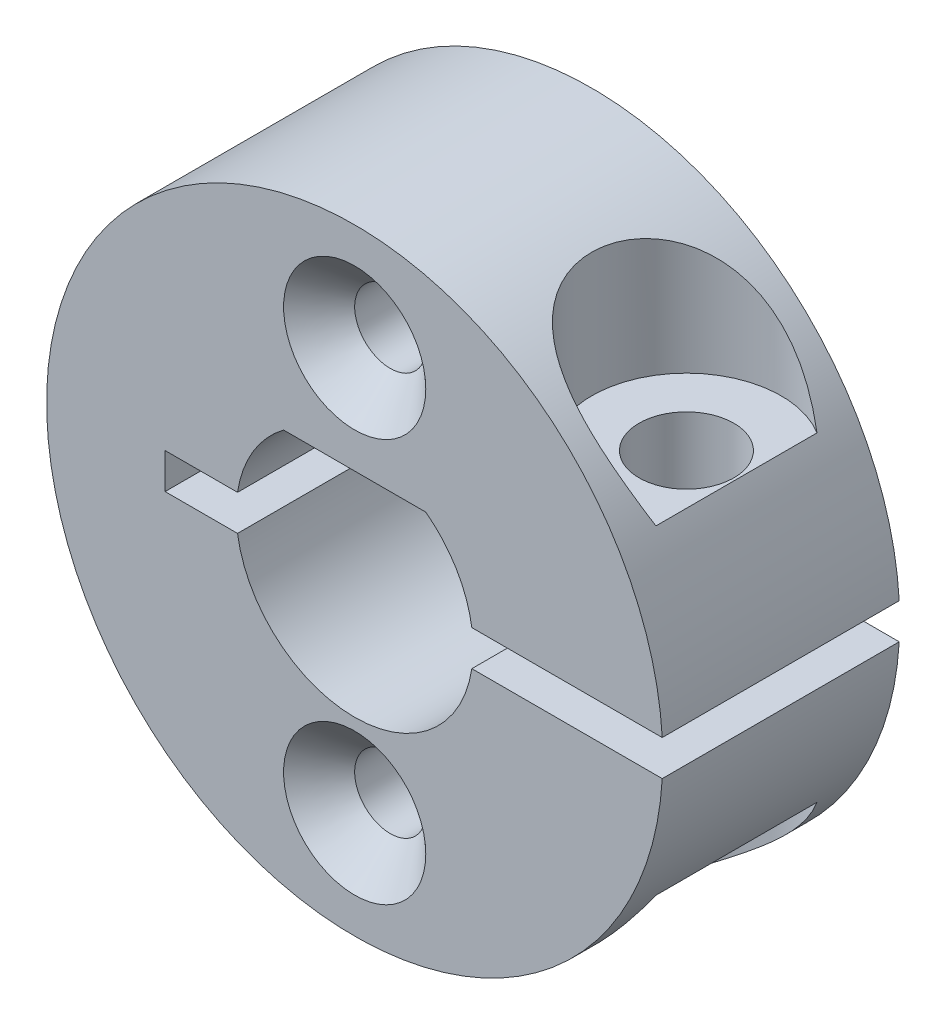
ISO-10303-21;
HEADER;
FILE_DESCRIPTION(('STEP AP214'),'2;1');
FILE_NAME('part.step','',(''),(''),'','','');
FILE_SCHEMA(('AUTOMOTIVE_DESIGN { 1 0 10303 214 1 1 1 1 }'));
ENDSEC;
DATA;
#1=APPLICATION_CONTEXT('core data for automotive mechanical design processes');
#2=APPLICATION_PROTOCOL_DEFINITION('international standard','automotive_design',2000,#1);
#3=PRODUCT_CONTEXT('',#1,'mechanical');
#4=PRODUCT('Part','Part','',(#3));
#5=PRODUCT_RELATED_PRODUCT_CATEGORY('part','',(#4));
#6=PRODUCT_DEFINITION_FORMATION('','',#4);
#7=PRODUCT_DEFINITION_CONTEXT('part definition',#1,'design');
#8=PRODUCT_DEFINITION('design','',#6,#7);
#9=PRODUCT_DEFINITION_SHAPE('','',#8);
#10=(LENGTH_UNIT() NAMED_UNIT(*) SI_UNIT(.MILLI.,.METRE.));
#11=(NAMED_UNIT(*) PLANE_ANGLE_UNIT() SI_UNIT($,.RADIAN.));
#12=(NAMED_UNIT(*) SI_UNIT($,.STERADIAN.) SOLID_ANGLE_UNIT());
#13=UNCERTAINTY_MEASURE_WITH_UNIT(LENGTH_MEASURE(1.E-05),#10,'distance_accuracy_value','');
#14=(GEOMETRIC_REPRESENTATION_CONTEXT(3) GLOBAL_UNCERTAINTY_ASSIGNED_CONTEXT((#13)) GLOBAL_UNIT_ASSIGNED_CONTEXT((#10,
#11,#12)) REPRESENTATION_CONTEXT('',''));
#15=CARTESIAN_POINT('',(0.,0.,0.));
#16=DIRECTION('',(0.,0.,1.));
#17=DIRECTION('',(1.,0.,0.));
#18=AXIS2_PLACEMENT_3D('',#15,#16,#17);
#19=CARTESIAN_POINT('',(0.,0.,10.));
#20=DIRECTION('',(0.,0.,-1.));
#21=DIRECTION('',(-1.,0.,0.));
#22=AXIS2_PLACEMENT_3D('',#19,#20,#21);
#23=CYLINDRICAL_SURFACE('',#22,13.);
#24=DIRECTION('',(0.,0.,-1.));
#25=VECTOR('',#24,1.);
#26=CARTESIAN_POINT('',(11.1102430216445,-6.75,10.));
#27=LINE('',#26,#25);
#28=CARTESIAN_POINT('',(11.1102430216445,-6.75,8.39806921495145));
#29=VERTEX_POINT('',#28);
#30=CARTESIAN_POINT('',(11.1102430216445,-6.75,1.60193078504855));
#31=VERTEX_POINT('',#30);
#32=EDGE_CURVE('E127',#29,#31,#27,.T.);
#33=ORIENTED_EDGE('',*,*,#32,.T.);
#34=CARTESIAN_POINT('',(11.1102430216445,-6.75,1.60193078504855));
#35=CARTESIAN_POINT('',(11.0444064886339,-6.85836250282828,1.56105019692549));
#36=CARTESIAN_POINT('',(10.9767387022368,-6.96616958788922,1.52167419438151));
#37=CARTESIAN_POINT('',(10.8376903133907,-7.18058575492827,1.44624707381436));
#38=CARTESIAN_POINT('',(10.7663087685173,-7.28719452438617,1.41019680624862));
#39=CARTESIAN_POINT('',(10.5460602216598,-7.60574696586519,1.3073006252089));
#40=CARTESIAN_POINT('',(10.3915468691562,-7.8156611205385,1.24599841764302));
#41=CARTESIAN_POINT('',(10.0656003074202,-8.23130564234522,1.14069525119497));
#42=CARTESIAN_POINT('',(9.89396803538389,-8.43694219224004,1.09693725676975));
#43=CARTESIAN_POINT('',(9.53654286218823,-8.83891515135851,1.03199936091257));
#44=CARTESIAN_POINT('',(9.35077511947723,-9.03526711984603,1.01078030711412));
#45=CARTESIAN_POINT('',(9.05137351789369,-9.33250368927912,0.998885529807429));
#46=CARTESIAN_POINT('',(8.94199200925726,-9.43735764973141,0.998875293624128));
#47=CARTESIAN_POINT('',(8.71982016044655,-9.64300898407959,1.00827609079164));
#48=CARTESIAN_POINT('',(8.60702973044204,-9.74380625091199,1.01768737262398));
#49=CARTESIAN_POINT('',(8.37927729912445,-9.94033391103569,1.04679583052513));
#50=CARTESIAN_POINT('',(8.26432738920542,-10.0360851101834,1.06644641460148));
#51=CARTESIAN_POINT('',(8.03269353410303,-10.2224219678433,1.11691349723385));
#52=CARTESIAN_POINT('',(7.91600987808258,-10.3130084758242,1.1477281533986));
#53=CARTESIAN_POINT('',(7.70024183498753,-10.4748050795409,1.21564264007694));
#54=CARTESIAN_POINT('',(7.601235613901,-10.5468408989512,1.25102562178444));
#55=CARTESIAN_POINT('',(7.40369723821172,-10.6864346398534,1.33078236248577));
#56=CARTESIAN_POINT('',(7.30516499433596,-10.7539934378756,1.37515435463002));
#57=CARTESIAN_POINT('',(7.10945839941089,-10.8843667687302,1.47326717626562));
#58=CARTESIAN_POINT('',(7.01228545749449,-10.9471766383634,1.52701704739224));
#59=CARTESIAN_POINT('',(6.82056301642758,-11.06764344043,1.64401171496058));
#60=CARTESIAN_POINT('',(6.72601221236956,-11.1253029688547,1.7072516844144));
#61=CARTESIAN_POINT('',(6.54001210403464,-11.2356585374988,1.84375809107758));
#62=CARTESIAN_POINT('',(6.44859082718051,-11.2883148213925,1.91709505644501));
#63=CARTESIAN_POINT('',(6.27093063052087,-11.3879673670559,2.07320059393047));
#64=CARTESIAN_POINT('',(6.18468928505903,-11.4349662885712,2.15596469808314));
#65=CARTESIAN_POINT('',(6.01866779341262,-11.5232147372369,2.33051275809555));
#66=CARTESIAN_POINT('',(5.93888610632626,-11.5644656372363,2.42229455122342));
#67=CARTESIAN_POINT('',(5.78702788527501,-11.6412005041175,2.6142545564272));
#68=CARTESIAN_POINT('',(5.71495028298459,-11.676685270945,2.71443160088737));
#69=CARTESIAN_POINT('',(5.58816334717196,-11.7378339475928,2.90927384511198));
#70=CARTESIAN_POINT('',(5.53240962227875,-11.7641715881063,3.00305065618071));
#71=CARTESIAN_POINT('',(5.42837026951741,-11.812539466831,3.19571529829379));
#72=CARTESIAN_POINT('',(5.38008396780901,-11.8345700937429,3.29460266709945));
#73=CARTESIAN_POINT('',(5.29159041227397,-11.8744021725624,3.49671479817059));
#74=CARTESIAN_POINT('',(5.2513809816011,-11.8922047642296,3.59993838266345));
#75=CARTESIAN_POINT('',(5.17952114441565,-11.9236781889315,3.80993471424299));
#76=CARTESIAN_POINT('',(5.14787052675594,-11.9373491238956,3.91670737370051));
#77=CARTESIAN_POINT('',(5.09514564299416,-11.959944090771,4.12644662437579));
#78=CARTESIAN_POINT('',(5.07355093072858,-11.9691036331856,4.22925745405264));
#79=CARTESIAN_POINT('',(5.0384891906787,-11.983905459311,4.43654280290431));
#80=CARTESIAN_POINT('',(5.02502484837765,-11.9895465808981,4.54101786009571));
#81=CARTESIAN_POINT('',(5.0063835142579,-11.9973424698034,4.75078208404859));
#82=CARTESIAN_POINT('',(5.00120249854318,-11.9994989299151,4.85607083053996));
#83=CARTESIAN_POINT('',(4.99916949094094,-12.0003460711225,5.06678194244003));
#84=CARTESIAN_POINT('',(5.00232055904468,-11.9990354789292,5.1722043427228));
#85=CARTESIAN_POINT('',(5.01682088879891,-11.9929799571057,5.38087702271856));
#86=CARTESIAN_POINT('',(5.02805307346238,-11.9882840707526,5.48413688646665));
#87=CARTESIAN_POINT('',(5.05847479901459,-11.9754793123009,5.68930202891988));
#88=CARTESIAN_POINT('',(5.07766722600145,-11.9673692023115,5.79120680247362));
#89=CARTESIAN_POINT('',(5.12380034779295,-11.9476900578122,5.99285933964835));
#90=CARTESIAN_POINT('',(5.15073770225563,-11.9361225143883,6.09260801328406));
#91=CARTESIAN_POINT('',(5.21209305460391,-11.9094586004754,6.28933362181703));
#92=CARTESIAN_POINT('',(5.24651380943621,-11.8943609293029,6.38630952026275));
#93=CARTESIAN_POINT('',(5.32253655501009,-11.8605369739623,6.57696359401098));
#94=CARTESIAN_POINT('',(5.36415176876668,-11.8418040004044,6.67063530783147));
#95=CARTESIAN_POINT('',(5.45408984210974,-11.8006503656215,6.85389961776771));
#96=CARTESIAN_POINT('',(5.50241512716994,-11.7782283703903,6.94349072325406));
#97=CARTESIAN_POINT('',(5.60522038267114,-11.7296518697129,7.11795135278335));
#98=CARTESIAN_POINT('',(5.65969770536404,-11.7034989687283,7.20282288476755));
#99=CARTESIAN_POINT('',(5.77425886476819,-11.6474033083623,7.36741492960236));
#100=CARTESIAN_POINT('',(5.83434477913897,-11.6174591430604,7.44713351492702));
#101=CARTESIAN_POINT('',(5.96079777282943,-11.55309575032,7.60259402643327));
#102=CARTESIAN_POINT('',(6.02727077837494,-11.51859530659,7.6782162701087));
#103=CARTESIAN_POINT('',(6.16466938497689,-11.4456507090642,7.82327815835543));
#104=CARTESIAN_POINT('',(6.23559659503248,-11.4072051269433,7.89271554660234));
#105=CARTESIAN_POINT('',(6.45393417836034,-11.2860230928263,8.09130435418691));
#106=CARTESIAN_POINT('',(6.60698811577309,-11.19739766749,8.21083853774437));
#107=CARTESIAN_POINT('',(6.9326801354561,-10.9989430617186,8.43036758148298));
#108=CARTESIAN_POINT('',(7.10594210673509,-10.8880810114998,8.52847783641712));
#109=CARTESIAN_POINT('',(7.45615920308619,-10.6513062945339,8.69515370221673));
#110=CARTESIAN_POINT('',(7.63311352178797,-10.5253968861579,8.76372569457465));
#111=CARTESIAN_POINT('',(7.93532175161968,-10.2983315720208,8.85796869369592));
#112=CARTESIAN_POINT('',(8.060957251345,-10.2003286933859,8.89029514880356));
#113=CARTESIAN_POINT('',(8.31013803126019,-9.99836530478952,8.94211632021865));
#114=CARTESIAN_POINT('',(8.43368253283319,-9.89440263618445,8.96160635482733));
#115=CARTESIAN_POINT('',(8.67815396110964,-9.68071045903177,8.98893866397693));
#116=CARTESIAN_POINT('',(8.79906325900591,-9.57095296897476,8.99671779858828));
#117=CARTESIAN_POINT('',(9.03678274190497,-9.34683224623497,9.0015978658513));
#118=CARTESIAN_POINT('',(9.15359156146348,-9.2324675060762,8.99869527494852));
#119=CARTESIAN_POINT('',(9.44868683427246,-8.93244605622932,8.97887744382251));
#120=CARTESIAN_POINT('',(9.62347855663997,-8.74379403089799,8.95483189948805));
#121=CARTESIAN_POINT('',(9.96007346704056,-8.35838391585003,8.88687474455435));
#122=CARTESIAN_POINT('',(10.1218585026647,-8.16161505797371,8.84293591839616));
#123=CARTESIAN_POINT('',(10.4293223429689,-7.76474612941376,8.73937788279758));
#124=CARTESIAN_POINT('',(10.5752065461739,-7.56474046964547,8.68000407767588));
#125=CARTESIAN_POINT('',(10.7836548355621,-7.26139102931121,8.58112623812576));
#126=CARTESIAN_POINT('',(10.8513191527558,-7.15986428409351,8.5465867592692));
#127=CARTESIAN_POINT('',(10.9832891232518,-6.95572572969535,8.47450855219625));
#128=CARTESIAN_POINT('',(11.0475953913088,-6.85311412328459,8.43697037615411));
#129=CARTESIAN_POINT('',(11.1102430216445,-6.75,8.39806921495145));
#130=B_SPLINE_CURVE_WITH_KNOTS('',3,(#34,#35,#36,#37,#38,#39,#40,#41,#42,#43,#44,#45,#46,#47,
#48,#49,#50,#51,#52,#53,#54,#55,#56,#57,#58,#59,#60,#61,#62,#63,#64,#65,#66,#67,#68,#69,#70,#71,
#72,#73,#74,#75,#76,#77,#78,#79,#80,#81,#82,#83,#84,#85,#86,#87,#88,#89,#90,#91,#92,#93,#94,#95,
#96,#97,#98,#99,#100,#101,#102,#103,#104,#105,#106,#107,#108,#109,#110,#111,#112,#113,#114,#115,
#116,#117,#118,#119,#120,#121,#122,#123,#124,#125,#126,#127,#128,#129),.UNSPECIFIED.,.F.,.F.,(4,
2,2,2,2,2,2,2,2,2,2,2,2,2,2,2,2,2,2,2,2,2,2,2,2,2,2,2,2,2,2,2,2,2,2,2,2,2,2,2,2,2,2,2,2,2,2,4),
(0.,0.399621169423797,0.79934424839363,1.60157110108195,2.41455288783741,3.22612012375474,
3.68036136165709,4.13461457995667,4.58681862641099,5.03894808022863,5.42093112387239,
5.80283915893852,6.18511746429663,6.567201984801,6.9521053290665,7.33682700265331,
7.72145663179687,8.10603285495777,8.44229950597239,8.77853579545724,9.11468134192127,
9.45081859487069,9.76679716775475,10.0828800522099,10.39880934239,10.7148546749847,
11.0264111244196,11.33808063192,11.6496159193079,11.9612661739521,12.273495435214,
12.5858378524923,12.8980463507782,13.2103709667924,13.5292976885229,13.8483402868132,
14.4859972768813,15.1670720213981,15.8479995515759,16.335141355608,16.8224607317365,
17.3123982222954,17.802497341811,18.5759060353472,19.3503760244696,20.1132147342169,
20.4935552001492,20.8738257916544),.UNSPECIFIED.);
#131=EDGE_CURVE('E11',#31,#29,#130,.T.);
#132=ORIENTED_EDGE('',*,*,#131,.T.);
#133=EDGE_LOOP('',(#33,#132));
#134=FACE_BOUND('',#133,.T.);
#135=DIRECTION('',(0.,0.,-1.));
#136=VECTOR('',#135,1.);
#137=CARTESIAN_POINT('',(12.9783473524174,0.75,10.));
#138=LINE('',#137,#136);
#139=CARTESIAN_POINT('',(12.9783473524174,0.75,0.));
#140=VERTEX_POINT('',#139);
#141=CARTESIAN_POINT('',(12.9783473524174,0.75,10.));
#142=VERTEX_POINT('',#141);
#143=EDGE_CURVE('E142',#140,#142,#138,.F.);
#144=ORIENTED_EDGE('',*,*,#143,.F.);
#145=CARTESIAN_POINT('',(0.,0.,0.));
#146=DIRECTION('',(0.,0.,1.));
#147=DIRECTION('',(1.,0.,0.));
#148=AXIS2_PLACEMENT_3D('',#145,#146,#147);
#149=CIRCLE('',#148,13.);
#150=CARTESIAN_POINT('',(12.9783473524174,-0.75,0.));
#151=VERTEX_POINT('',#150);
#152=EDGE_CURVE('E229',#140,#151,#149,.T.);
#153=ORIENTED_EDGE('',*,*,#152,.T.);
#154=DIRECTION('',(0.,0.,-1.));
#155=VECTOR('',#154,1.);
#156=CARTESIAN_POINT('',(12.9783473524174,-0.75,10.));
#157=LINE('',#156,#155);
#158=CARTESIAN_POINT('',(12.9783473524174,-0.75,10.));
#159=VERTEX_POINT('',#158);
#160=EDGE_CURVE('E275',#151,#159,#157,.F.);
#161=ORIENTED_EDGE('',*,*,#160,.T.);
#162=CARTESIAN_POINT('',(0.,0.,10.));
#163=DIRECTION('',(0.,0.,1.));
#164=DIRECTION('',(1.,0.,0.));
#165=AXIS2_PLACEMENT_3D('',#162,#163,#164);
#166=CIRCLE('',#165,13.);
#167=EDGE_CURVE('E262',#142,#159,#166,.T.);
#168=ORIENTED_EDGE('',*,*,#167,.F.);
#169=EDGE_LOOP('',(#144,#153,#161,#168));
#170=FACE_BOUND('',#169,.T.);
#171=CARTESIAN_POINT('',(11.1102430216445,6.75,1.60193078504855));
#172=CARTESIAN_POINT('',(11.0444064886339,6.85836250282828,1.56105019692549));
#173=CARTESIAN_POINT('',(10.9767387022368,6.96616958788922,1.52167419438151));
#174=CARTESIAN_POINT('',(10.8376903133907,7.18058575492827,1.44624707381436));
#175=CARTESIAN_POINT('',(10.7663087685173,7.28719452438617,1.41019680624862));
#176=CARTESIAN_POINT('',(10.5460602216598,7.60574696586519,1.3073006252089));
#177=CARTESIAN_POINT('',(10.3915468691562,7.8156611205385,1.24599841764302));
#178=CARTESIAN_POINT('',(10.0656003074202,8.23130564234522,1.14069525119497));
#179=CARTESIAN_POINT('',(9.89396803538389,8.43694219224004,1.09693725676975));
#180=CARTESIAN_POINT('',(9.53654286218823,8.83891515135851,1.03199936091257));
#181=CARTESIAN_POINT('',(9.35077511947723,9.03526711984603,1.01078030711412));
#182=CARTESIAN_POINT('',(9.05137351789369,9.33250368927912,0.998885529807429));
#183=CARTESIAN_POINT('',(8.94199200925726,9.43735764973141,0.998875293624128));
#184=CARTESIAN_POINT('',(8.71982016044655,9.64300898407959,1.00827609079164));
#185=CARTESIAN_POINT('',(8.60702973044204,9.74380625091199,1.01768737262398));
#186=CARTESIAN_POINT('',(8.37927729912445,9.94033391103569,1.04679583052513));
#187=CARTESIAN_POINT('',(8.26432738920542,10.0360851101834,1.06644641460148));
#188=CARTESIAN_POINT('',(8.03269353410303,10.2224219678433,1.11691349723385));
#189=CARTESIAN_POINT('',(7.91600987808258,10.3130084758242,1.1477281533986));
#190=CARTESIAN_POINT('',(7.70024183498753,10.4748050795409,1.21564264007694));
#191=CARTESIAN_POINT('',(7.601235613901,10.5468408989512,1.25102562178444));
#192=CARTESIAN_POINT('',(7.40369723821172,10.6864346398534,1.33078236248577));
#193=CARTESIAN_POINT('',(7.30516499433596,10.7539934378756,1.37515435463002));
#194=CARTESIAN_POINT('',(7.10945839941089,10.8843667687302,1.47326717626562));
#195=CARTESIAN_POINT('',(7.01228545749449,10.9471766383634,1.52701704739224));
#196=CARTESIAN_POINT('',(6.82056301642758,11.06764344043,1.64401171496058));
#197=CARTESIAN_POINT('',(6.72601221236956,11.1253029688547,1.7072516844144));
#198=CARTESIAN_POINT('',(6.54001210403464,11.2356585374988,1.84375809107758));
#199=CARTESIAN_POINT('',(6.44859082718051,11.2883148213925,1.91709505644501));
#200=CARTESIAN_POINT('',(6.27093063052087,11.3879673670559,2.07320059393047));
#201=CARTESIAN_POINT('',(6.18468928505903,11.4349662885712,2.15596469808314));
#202=CARTESIAN_POINT('',(6.01866779341262,11.5232147372369,2.33051275809555));
#203=CARTESIAN_POINT('',(5.93888610632626,11.5644656372363,2.42229455122342));
#204=CARTESIAN_POINT('',(5.78702788527501,11.6412005041175,2.6142545564272));
#205=CARTESIAN_POINT('',(5.71495028298459,11.676685270945,2.71443160088737));
#206=CARTESIAN_POINT('',(5.58816334717196,11.7378339475928,2.90927384511198));
#207=CARTESIAN_POINT('',(5.53240962227875,11.7641715881063,3.00305065618071));
#208=CARTESIAN_POINT('',(5.42837026951741,11.812539466831,3.19571529829379));
#209=CARTESIAN_POINT('',(5.38008396780901,11.8345700937429,3.29460266709945));
#210=CARTESIAN_POINT('',(5.29159041227397,11.8744021725624,3.49671479817059));
#211=CARTESIAN_POINT('',(5.2513809816011,11.8922047642296,3.59993838266345));
#212=CARTESIAN_POINT('',(5.17952114441565,11.9236781889315,3.80993471424299));
#213=CARTESIAN_POINT('',(5.14787052675594,11.9373491238956,3.91670737370051));
#214=CARTESIAN_POINT('',(5.09514564299416,11.959944090771,4.12644662437579));
#215=CARTESIAN_POINT('',(5.07355093072858,11.9691036331856,4.22925745405264));
#216=CARTESIAN_POINT('',(5.0384891906787,11.983905459311,4.43654280290431));
#217=CARTESIAN_POINT('',(5.02502484837765,11.9895465808981,4.54101786009571));
#218=CARTESIAN_POINT('',(5.0063835142579,11.9973424698034,4.75078208404859));
#219=CARTESIAN_POINT('',(5.00120249854318,11.9994989299151,4.85607083053996));
#220=CARTESIAN_POINT('',(4.99916949094094,12.0003460711225,5.06678194244003));
#221=CARTESIAN_POINT('',(5.00232055904468,11.9990354789292,5.1722043427228));
#222=CARTESIAN_POINT('',(5.01682088879891,11.9929799571057,5.38087702271856));
#223=CARTESIAN_POINT('',(5.02805307346238,11.9882840707526,5.48413688646665));
#224=CARTESIAN_POINT('',(5.05847479901459,11.9754793123009,5.68930202891988));
#225=CARTESIAN_POINT('',(5.07766722600145,11.9673692023115,5.79120680247362));
#226=CARTESIAN_POINT('',(5.12380034779295,11.9476900578122,5.99285933964835));
#227=CARTESIAN_POINT('',(5.15073770225563,11.9361225143883,6.09260801328406));
#228=CARTESIAN_POINT('',(5.21209305460391,11.9094586004754,6.28933362181703));
#229=CARTESIAN_POINT('',(5.24651380943621,11.8943609293029,6.38630952026275));
#230=CARTESIAN_POINT('',(5.32253655501009,11.8605369739623,6.57696359401098));
#231=CARTESIAN_POINT('',(5.36415176876668,11.8418040004044,6.67063530783147));
#232=CARTESIAN_POINT('',(5.45408984210974,11.8006503656215,6.85389961776771));
#233=CARTESIAN_POINT('',(5.50241512716994,11.7782283703903,6.94349072325406));
#234=CARTESIAN_POINT('',(5.60522038267114,11.7296518697129,7.11795135278335));
#235=CARTESIAN_POINT('',(5.65969770536404,11.7034989687283,7.20282288476755));
#236=CARTESIAN_POINT('',(5.77425886476819,11.6474033083623,7.36741492960236));
#237=CARTESIAN_POINT('',(5.83434477913897,11.6174591430604,7.44713351492702));
#238=CARTESIAN_POINT('',(5.96079777282943,11.55309575032,7.60259402643327));
#239=CARTESIAN_POINT('',(6.02727077837494,11.51859530659,7.6782162701087));
#240=CARTESIAN_POINT('',(6.16466938497689,11.4456507090642,7.82327815835543));
#241=CARTESIAN_POINT('',(6.23559659503248,11.4072051269433,7.89271554660234));
#242=CARTESIAN_POINT('',(6.45393417836034,11.2860230928263,8.09130435418691));
#243=CARTESIAN_POINT('',(6.60698811577309,11.19739766749,8.21083853774437));
#244=CARTESIAN_POINT('',(6.9326801354561,10.9989430617186,8.43036758148298));
#245=CARTESIAN_POINT('',(7.10594210673509,10.8880810114998,8.52847783641712));
#246=CARTESIAN_POINT('',(7.45615920308619,10.6513062945339,8.69515370221673));
#247=CARTESIAN_POINT('',(7.63311352178797,10.5253968861579,8.76372569457465));
#248=CARTESIAN_POINT('',(7.93532175161968,10.2983315720208,8.85796869369592));
#249=CARTESIAN_POINT('',(8.060957251345,10.2003286933859,8.89029514880356));
#250=CARTESIAN_POINT('',(8.31013803126019,9.99836530478952,8.94211632021865));
#251=CARTESIAN_POINT('',(8.43368253283319,9.89440263618445,8.96160635482733));
#252=CARTESIAN_POINT('',(8.67815396110964,9.68071045903177,8.98893866397693));
#253=CARTESIAN_POINT('',(8.79906325900591,9.57095296897476,8.99671779858828));
#254=CARTESIAN_POINT('',(9.03678274190497,9.34683224623497,9.0015978658513));
#255=CARTESIAN_POINT('',(9.15359156146348,9.2324675060762,8.99869527494852));
#256=CARTESIAN_POINT('',(9.44868683427246,8.93244605622932,8.97887744382251));
#257=CARTESIAN_POINT('',(9.62347855663997,8.74379403089799,8.95483189948805));
#258=CARTESIAN_POINT('',(9.96007346704056,8.35838391585003,8.88687474455435));
#259=CARTESIAN_POINT('',(10.1218585026647,8.16161505797371,8.84293591839616));
#260=CARTESIAN_POINT('',(10.4293223429689,7.76474612941376,8.73937788279758));
#261=CARTESIAN_POINT('',(10.5752065461739,7.56474046964547,8.68000407767588));
#262=CARTESIAN_POINT('',(10.7836548355621,7.26139102931121,8.58112623812576));
#263=CARTESIAN_POINT('',(10.8513191527558,7.15986428409351,8.5465867592692));
#264=CARTESIAN_POINT('',(10.9832891232518,6.95572572969535,8.47450855219625));
#265=CARTESIAN_POINT('',(11.0475953913088,6.85311412328459,8.43697037615411));
#266=CARTESIAN_POINT('',(11.1102430216445,6.75,8.39806921495145));
#267=B_SPLINE_CURVE_WITH_KNOTS('',3,(#171,#172,#173,#174,#175,#176,#177,#178,#179,#180,#181,
#182,#183,#184,#185,#186,#187,#188,#189,#190,#191,#192,#193,#194,#195,#196,#197,#198,#199,#200,
#201,#202,#203,#204,#205,#206,#207,#208,#209,#210,#211,#212,#213,#214,#215,#216,#217,#218,#219,
#220,#221,#222,#223,#224,#225,#226,#227,#228,#229,#230,#231,#232,#233,#234,#235,#236,#237,#238,
#239,#240,#241,#242,#243,#244,#245,#246,#247,#248,#249,#250,#251,#252,#253,#254,#255,#256,#257,
#258,#259,#260,#261,#262,#263,#264,#265,#266),.UNSPECIFIED.,.F.,.F.,(4,2,2,2,2,2,2,2,2,2,2,2,2,
2,2,2,2,2,2,2,2,2,2,2,2,2,2,2,2,2,2,2,2,2,2,2,2,2,2,2,2,2,2,2,2,2,2,4),(0.,0.399621169423797,
0.79934424839363,1.60157110108195,2.41455288783741,3.22612012375474,3.68036136165709,
4.13461457995667,4.58681862641099,5.03894808022863,5.42093112387239,5.80283915893852,
6.18511746429663,6.567201984801,6.9521053290665,7.33682700265331,7.72145663179687,
8.10603285495777,8.44229950597239,8.77853579545724,9.11468134192127,9.45081859487069,
9.76679716775475,10.0828800522099,10.39880934239,10.7148546749847,11.0264111244196,
11.33808063192,11.6496159193079,11.9612661739521,12.273495435214,12.5858378524923,
12.8980463507782,13.2103709667924,13.5292976885229,13.8483402868132,14.4859972768813,
15.1670720213981,15.8479995515759,16.335141355608,16.8224607317365,17.3123982222954,
17.802497341811,18.5759060353472,19.3503760244696,20.1132147342169,20.4935552001492,
20.8738257916544),.UNSPECIFIED.);
#268=CARTESIAN_POINT('',(11.1102430216445,6.75,1.60193078504855));
#269=VERTEX_POINT('',#268);
#270=CARTESIAN_POINT('',(11.1102430216445,6.75,8.39806921495145));
#271=VERTEX_POINT('',#270);
#272=EDGE_CURVE('E48',#269,#271,#267,.T.);
#273=ORIENTED_EDGE('',*,*,#272,.F.);
#274=DIRECTION('',(0.,0.,-1.));
#275=VECTOR('',#274,1.);
#276=CARTESIAN_POINT('',(11.1102430216445,6.75,10.));
#277=LINE('',#276,#275);
#278=EDGE_CURVE('E146',#269,#271,#277,.F.);
#279=ORIENTED_EDGE('',*,*,#278,.T.);
#280=EDGE_LOOP('',(#273,#279));
#281=FACE_BOUND('',#280,.T.);
#282=ADVANCED_FACE('F35',(#134,#170,#281),#23,.T.);
#283=CARTESIAN_POINT('',(0.,0.,10.));
#284=DIRECTION('',(0.,0.,1.));
#285=DIRECTION('',(1.,0.,0.));
#286=AXIS2_PLACEMENT_3D('',#283,#284,#285);
#287=PLANE('',#286);
#288=CARTESIAN_POINT('',(0.,-8.5,10.));
#289=DIRECTION('',(0.,0.,1.));
#290=DIRECTION('',(1.,0.,0.));
#291=AXIS2_PLACEMENT_3D('',#288,#289,#290);
#292=CIRCLE('',#291,3.);
#293=CARTESIAN_POINT('',(3.,-8.5,10.));
#294=VERTEX_POINT('',#293);
#295=EDGE_CURVE('E151',#294,#294,#292,.F.);
#296=ORIENTED_EDGE('',*,*,#295,.T.);
#297=EDGE_LOOP('',(#296));
#298=FACE_BOUND('',#297,.T.);
#299=CARTESIAN_POINT('',(0.,8.5,10.));
#300=DIRECTION('',(0.,0.,1.));
#301=DIRECTION('',(1.,0.,0.));
#302=AXIS2_PLACEMENT_3D('',#299,#300,#301);
#303=CIRCLE('',#302,3.);
#304=CARTESIAN_POINT('',(3.,8.5,10.));
#305=VERTEX_POINT('',#304);
#306=EDGE_CURVE('E278',#305,#305,#303,.F.);
#307=ORIENTED_EDGE('',*,*,#306,.T.);
#308=EDGE_LOOP('',(#307));
#309=FACE_BOUND('',#308,.T.);
#310=CARTESIAN_POINT('',(0.,0.,10.));
#311=DIRECTION('',(0.,0.,1.));
#312=DIRECTION('',(1.,0.,0.));
#313=AXIS2_PLACEMENT_3D('',#310,#311,#312);
#314=CIRCLE('',#313,5.);
#315=CARTESIAN_POINT('',(4.9434299833213,0.75,10.));
#316=VERTEX_POINT('',#315);
#317=CARTESIAN_POINT('',(3.,4.,10.));
#318=VERTEX_POINT('',#317);
#319=EDGE_CURVE('E251',#316,#318,#314,.T.);
#320=ORIENTED_EDGE('',*,*,#319,.F.);
#321=DIRECTION('',(1.,0.,0.));
#322=VECTOR('',#321,1.);
#323=CARTESIAN_POINT('',(0.,0.75,10.));
#324=LINE('',#323,#322);
#325=EDGE_CURVE('E302',#316,#142,#324,.T.);
#326=ORIENTED_EDGE('',*,*,#325,.T.);
#327=ORIENTED_EDGE('',*,*,#167,.T.);
#328=DIRECTION('',(1.,0.,0.));
#329=VECTOR('',#328,1.);
#330=CARTESIAN_POINT('',(0.,-0.75,10.));
#331=LINE('',#330,#329);
#332=CARTESIAN_POINT('',(4.9434299833213,-0.75,10.));
#333=VERTEX_POINT('',#332);
#334=EDGE_CURVE('E327',#333,#159,#331,.T.);
#335=ORIENTED_EDGE('',*,*,#334,.F.);
#336=CARTESIAN_POINT('',(-4.9434299833213,-0.75,10.));
#337=VERTEX_POINT('',#336);
#338=EDGE_CURVE('E252',#337,#333,#314,.T.);
#339=ORIENTED_EDGE('',*,*,#338,.F.);
#340=CARTESIAN_POINT('',(-8.,-0.75,10.));
#341=VERTEX_POINT('',#340);
#342=EDGE_CURVE('E232',#341,#337,#331,.T.);
#343=ORIENTED_EDGE('',*,*,#342,.F.);
#344=DIRECTION('',(0.,-1.,0.));
#345=VECTOR('',#344,1.);
#346=CARTESIAN_POINT('',(-8.,0.,10.));
#347=LINE('',#346,#345);
#348=CARTESIAN_POINT('',(-8.,0.75,10.));
#349=VERTEX_POINT('',#348);
#350=EDGE_CURVE('E328',#349,#341,#347,.T.);
#351=ORIENTED_EDGE('',*,*,#350,.F.);
#352=CARTESIAN_POINT('',(-4.9434299833213,0.75,10.));
#353=VERTEX_POINT('',#352);
#354=EDGE_CURVE('E310',#349,#353,#324,.T.);
#355=ORIENTED_EDGE('',*,*,#354,.T.);
#356=CARTESIAN_POINT('',(-3.,4.,10.));
#357=VERTEX_POINT('',#356);
#358=EDGE_CURVE('E254',#357,#353,#314,.T.);
#359=ORIENTED_EDGE('',*,*,#358,.F.);
#360=DIRECTION('',(-1.,0.,0.));
#361=VECTOR('',#360,1.);
#362=CARTESIAN_POINT('',(-3.,4.,10.));
#363=LINE('',#362,#361);
#364=EDGE_CURVE('E259',#318,#357,#363,.T.);
#365=ORIENTED_EDGE('',*,*,#364,.F.);
#366=EDGE_LOOP('',(#320,#326,#327,#335,#339,#343,#351,#355,#359,#365));
#367=FACE_BOUND('',#366,.T.);
#368=ADVANCED_FACE('F137',(#298,#309,#367),#287,.T.);
#369=CARTESIAN_POINT('',(0.,0.,0.));
#370=DIRECTION('',(0.,0.,1.));
#371=DIRECTION('',(1.,0.,0.));
#372=AXIS2_PLACEMENT_3D('',#369,#370,#371);
#373=PLANE('',#372);
#374=CARTESIAN_POINT('',(0.,8.5,0.));
#375=DIRECTION('',(0.,0.,1.));
#376=DIRECTION('',(1.,0.,0.));
#377=AXIS2_PLACEMENT_3D('',#374,#375,#376);
#378=CIRCLE('',#377,1.5);
#379=CARTESIAN_POINT('',(1.5,8.5,0.));
#380=VERTEX_POINT('',#379);
#381=EDGE_CURVE('E217',#380,#380,#378,.T.);
#382=ORIENTED_EDGE('',*,*,#381,.T.);
#383=EDGE_LOOP('',(#382));
#384=FACE_BOUND('',#383,.T.);
#385=CARTESIAN_POINT('',(0.,-8.5,0.));
#386=DIRECTION('',(0.,0.,1.));
#387=DIRECTION('',(1.,0.,0.));
#388=AXIS2_PLACEMENT_3D('',#385,#386,#387);
#389=CIRCLE('',#388,1.5);
#390=CARTESIAN_POINT('',(1.5,-8.5,0.));
#391=VERTEX_POINT('',#390);
#392=EDGE_CURVE('E221',#391,#391,#389,.T.);
#393=ORIENTED_EDGE('',*,*,#392,.T.);
#394=EDGE_LOOP('',(#393));
#395=FACE_BOUND('',#394,.T.);
#396=DIRECTION('',(1.,0.,0.));
#397=VECTOR('',#396,1.);
#398=CARTESIAN_POINT('',(0.,0.75,0.));
#399=LINE('',#398,#397);
#400=CARTESIAN_POINT('',(4.9434299833213,0.75,0.));
#401=VERTEX_POINT('',#400);
#402=EDGE_CURVE('E223',#401,#140,#399,.T.);
#403=ORIENTED_EDGE('',*,*,#402,.F.);
#404=CARTESIAN_POINT('',(0.,0.,0.));
#405=DIRECTION('',(0.,0.,1.));
#406=DIRECTION('',(1.,0.,0.));
#407=AXIS2_PLACEMENT_3D('',#404,#405,#406);
#408=CIRCLE('',#407,5.);
#409=CARTESIAN_POINT('',(3.,4.,0.));
#410=VERTEX_POINT('',#409);
#411=EDGE_CURVE('E226',#401,#410,#408,.T.);
#412=ORIENTED_EDGE('',*,*,#411,.T.);
#413=DIRECTION('',(-1.,0.,0.));
#414=VECTOR('',#413,1.);
#415=CARTESIAN_POINT('',(-3.,4.,0.));
#416=LINE('',#415,#414);
#417=CARTESIAN_POINT('',(-3.,4.,0.));
#418=VERTEX_POINT('',#417);
#419=EDGE_CURVE('E249',#410,#418,#416,.T.);
#420=ORIENTED_EDGE('',*,*,#419,.T.);
#421=CARTESIAN_POINT('',(-4.9434299833213,0.75,0.));
#422=VERTEX_POINT('',#421);
#423=EDGE_CURVE('E243',#418,#422,#408,.T.);
#424=ORIENTED_EDGE('',*,*,#423,.T.);
#425=CARTESIAN_POINT('',(-8.,0.75,0.));
#426=VERTEX_POINT('',#425);
#427=EDGE_CURVE('E231',#426,#422,#399,.T.);
#428=ORIENTED_EDGE('',*,*,#427,.F.);
#429=DIRECTION('',(0.,-1.,0.));
#430=VECTOR('',#429,1.);
#431=CARTESIAN_POINT('',(-8.,0.,0.));
#432=LINE('',#431,#430);
#433=CARTESIAN_POINT('',(-8.,-0.75,0.));
#434=VERTEX_POINT('',#433);
#435=EDGE_CURVE('E335',#426,#434,#432,.T.);
#436=ORIENTED_EDGE('',*,*,#435,.T.);
#437=DIRECTION('',(1.,0.,0.));
#438=VECTOR('',#437,1.);
#439=CARTESIAN_POINT('',(0.,-0.75,0.));
#440=LINE('',#439,#438);
#441=CARTESIAN_POINT('',(-4.9434299833213,-0.75,0.));
#442=VERTEX_POINT('',#441);
#443=EDGE_CURVE('E324',#434,#442,#440,.T.);
#444=ORIENTED_EDGE('',*,*,#443,.T.);
#445=CARTESIAN_POINT('',(4.9434299833213,-0.75,0.));
#446=VERTEX_POINT('',#445);
#447=EDGE_CURVE('E241',#442,#446,#408,.T.);
#448=ORIENTED_EDGE('',*,*,#447,.T.);
#449=EDGE_CURVE('E334',#446,#151,#440,.T.);
#450=ORIENTED_EDGE('',*,*,#449,.T.);
#451=ORIENTED_EDGE('',*,*,#152,.F.);
#452=EDGE_LOOP('',(#403,#412,#420,#424,#428,#436,#444,#448,#450,#451));
#453=FACE_BOUND('',#452,.T.);
#454=ADVANCED_FACE('F206',(#384,#395,#453),#373,.F.);
#455=CARTESIAN_POINT('',(0.,0.,10.));
#456=DIRECTION('',(0.,0.,-1.));
#457=DIRECTION('',(-1.,0.,0.));
#458=AXIS2_PLACEMENT_3D('',#455,#456,#457);
#459=CYLINDRICAL_SURFACE('',#458,5.);
#460=ORIENTED_EDGE('',*,*,#358,.T.);
#461=DIRECTION('',(0.,0.,-1.));
#462=VECTOR('',#461,1.);
#463=CARTESIAN_POINT('',(-4.9434299833213,0.75,10.));
#464=LINE('',#463,#462);
#465=EDGE_CURVE('E314',#353,#422,#464,.T.);
#466=ORIENTED_EDGE('',*,*,#465,.T.);
#467=ORIENTED_EDGE('',*,*,#423,.F.);
#468=DIRECTION('',(0.,0.,-1.));
#469=VECTOR('',#468,1.);
#470=CARTESIAN_POINT('',(-3.,4.,10.));
#471=LINE('',#470,#469);
#472=EDGE_CURVE('E256',#357,#418,#471,.T.);
#473=ORIENTED_EDGE('',*,*,#472,.F.);
#474=EDGE_LOOP('',(#460,#466,#467,#473));
#475=FACE_BOUND('',#474,.T.);
#476=ADVANCED_FACE('F200',(#475),#459,.F.);
#477=ORIENTED_EDGE('',*,*,#411,.F.);
#478=DIRECTION('',(0.,0.,-1.));
#479=VECTOR('',#478,1.);
#480=CARTESIAN_POINT('',(4.9434299833213,0.75,10.));
#481=LINE('',#480,#479);
#482=EDGE_CURVE('E237',#401,#316,#481,.F.);
#483=ORIENTED_EDGE('',*,*,#482,.T.);
#484=ORIENTED_EDGE('',*,*,#319,.T.);
#485=DIRECTION('',(0.,0.,-1.));
#486=VECTOR('',#485,1.);
#487=CARTESIAN_POINT('',(3.,4.,10.));
#488=LINE('',#487,#486);
#489=EDGE_CURVE('E240',#318,#410,#488,.T.);
#490=ORIENTED_EDGE('',*,*,#489,.T.);
#491=EDGE_LOOP('',(#477,#483,#484,#490));
#492=FACE_BOUND('',#491,.T.);
#493=ADVANCED_FACE('F201',(#492),#459,.F.);
#494=CARTESIAN_POINT('',(9.,-13.,5.));
#495=DIRECTION('',(0.,1.,0.));
#496=DIRECTION('',(0.,0.,1.));
#497=AXIS2_PLACEMENT_3D('',#494,#495,#496);
#498=CYLINDRICAL_SURFACE('',#497,2.);
#499=CARTESIAN_POINT('',(9.,6.75,5.));
#500=DIRECTION('',(0.,-1.,0.));
#501=DIRECTION('',(0.,0.,-1.));
#502=AXIS2_PLACEMENT_3D('',#499,#500,#501);
#503=CIRCLE('',#502,2.);
#504=CARTESIAN_POINT('',(9.,6.75,3.));
#505=VERTEX_POINT('',#504);
#506=EDGE_CURVE('E158',#505,#505,#503,.F.);
#507=ORIENTED_EDGE('',*,*,#506,.T.);
#508=EDGE_LOOP('',(#507));
#509=FACE_BOUND('',#508,.T.);
#510=CARTESIAN_POINT('',(9.,0.750000000000001,5.));
#511=DIRECTION('',(0.,-1.,0.));
#512=DIRECTION('',(0.,0.,-1.));
#513=AXIS2_PLACEMENT_3D('',#510,#511,#512);
#514=CIRCLE('',#513,2.);
#515=CARTESIAN_POINT('',(9.,0.750000000000001,3.));
#516=VERTEX_POINT('',#515);
#517=EDGE_CURVE('E272',#516,#516,#514,.F.);
#518=ORIENTED_EDGE('',*,*,#517,.F.);
#519=EDGE_LOOP('',(#518));
#520=FACE_BOUND('',#519,.T.);
#521=ADVANCED_FACE('F187',(#509,#520),#498,.F.);
#522=CARTESIAN_POINT('',(0.,8.5,10.));
#523=DIRECTION('',(0.,0.,-1.));
#524=DIRECTION('',(-1.,0.,0.));
#525=AXIS2_PLACEMENT_3D('',#522,#523,#524);
#526=CYLINDRICAL_SURFACE('',#525,1.5);
#527=CARTESIAN_POINT('',(0.,8.5,8.50000000000001));
#528=DIRECTION('',(0.,0.,1.));
#529=DIRECTION('',(1.,0.,0.));
#530=AXIS2_PLACEMENT_3D('',#527,#528,#529);
#531=CIRCLE('',#530,1.5);
#532=CARTESIAN_POINT('',(1.5,8.5,8.50000000000001));
#533=VERTEX_POINT('',#532);
#534=EDGE_CURVE('E148',#533,#533,#531,.T.);
#535=ORIENTED_EDGE('',*,*,#534,.T.);
#536=EDGE_LOOP('',(#535));
#537=FACE_BOUND('',#536,.T.);
#538=ORIENTED_EDGE('',*,*,#381,.F.);
#539=EDGE_LOOP('',(#538));
#540=FACE_BOUND('',#539,.T.);
#541=ADVANCED_FACE('F198',(#537,#540),#526,.F.);
#542=DIRECTION('',(0.,0.,-1.));
#543=VECTOR('',#542,1.);
#544=CARTESIAN_POINT('',(-4.9434299833213,-0.75,10.));
#545=LINE('',#544,#543);
#546=EDGE_CURVE('E319',#337,#442,#545,.T.);
#547=ORIENTED_EDGE('',*,*,#546,.F.);
#548=ORIENTED_EDGE('',*,*,#338,.T.);
#549=DIRECTION('',(0.,0.,-1.));
#550=VECTOR('',#549,1.);
#551=CARTESIAN_POINT('',(4.9434299833213,-0.75,10.));
#552=LINE('',#551,#550);
#553=EDGE_CURVE('E270',#446,#333,#552,.F.);
#554=ORIENTED_EDGE('',*,*,#553,.F.);
#555=ORIENTED_EDGE('',*,*,#447,.F.);
#556=EDGE_LOOP('',(#547,#548,#554,#555));
#557=FACE_BOUND('',#556,.T.);
#558=ADVANCED_FACE('F194',(#557),#459,.F.);
#559=CARTESIAN_POINT('',(-3.,4.,10.));
#560=DIRECTION('',(0.,-1.,0.));
#561=DIRECTION('',(0.,0.,-1.));
#562=AXIS2_PLACEMENT_3D('',#559,#560,#561);
#563=PLANE('',#562);
#564=ORIENTED_EDGE('',*,*,#419,.F.);
#565=ORIENTED_EDGE('',*,*,#489,.F.);
#566=ORIENTED_EDGE('',*,*,#364,.T.);
#567=ORIENTED_EDGE('',*,*,#472,.T.);
#568=EDGE_LOOP('',(#564,#565,#566,#567));
#569=FACE_BOUND('',#568,.T.);
#570=ADVANCED_FACE('F190',(#569),#563,.T.);
#571=CARTESIAN_POINT('',(0.,-8.5,10.));
#572=DIRECTION('',(0.,0.,-1.));
#573=DIRECTION('',(-1.,0.,0.));
#574=AXIS2_PLACEMENT_3D('',#571,#572,#573);
#575=CYLINDRICAL_SURFACE('',#574,1.5);
#576=CARTESIAN_POINT('',(0.,-8.5,8.50000000000001));
#577=DIRECTION('',(0.,0.,1.));
#578=DIRECTION('',(1.,0.,0.));
#579=AXIS2_PLACEMENT_3D('',#576,#577,#578);
#580=CIRCLE('',#579,1.5);
#581=CARTESIAN_POINT('',(1.5,-8.5,8.50000000000001));
#582=VERTEX_POINT('',#581);
#583=EDGE_CURVE('E265',#582,#582,#580,.T.);
#584=ORIENTED_EDGE('',*,*,#583,.T.);
#585=EDGE_LOOP('',(#584));
#586=FACE_BOUND('',#585,.T.);
#587=ORIENTED_EDGE('',*,*,#392,.F.);
#588=EDGE_LOOP('',(#587));
#589=FACE_BOUND('',#588,.T.);
#590=ADVANCED_FACE('F185',(#586,#589),#575,.F.);
#591=CARTESIAN_POINT('',(9.,-6.75,5.));
#592=DIRECTION('',(0.,1.,0.));
#593=DIRECTION('',(0.,0.,1.));
#594=AXIS2_PLACEMENT_3D('',#591,#592,#593);
#595=CIRCLE('',#594,2.);
#596=CARTESIAN_POINT('',(9.,-6.75,7.));
#597=VERTEX_POINT('',#596);
#598=EDGE_CURVE('E130',#597,#597,#595,.F.);
#599=ORIENTED_EDGE('',*,*,#598,.T.);
#600=EDGE_LOOP('',(#599));
#601=FACE_BOUND('',#600,.T.);
#602=CARTESIAN_POINT('',(9.,-0.750000000000001,5.));
#603=DIRECTION('',(0.,-1.,0.));
#604=DIRECTION('',(0.,0.,-1.));
#605=AXIS2_PLACEMENT_3D('',#602,#603,#604);
#606=CIRCLE('',#605,2.);
#607=CARTESIAN_POINT('',(9.,-0.750000000000001,3.));
#608=VERTEX_POINT('',#607);
#609=EDGE_CURVE('E267',#608,#608,#606,.F.);
#610=ORIENTED_EDGE('',*,*,#609,.T.);
#611=EDGE_LOOP('',(#610));
#612=FACE_BOUND('',#611,.T.);
#613=ADVANCED_FACE('F171',(#601,#612),#498,.F.);
#614=CARTESIAN_POINT('',(0.,-0.75,0.));
#615=DIRECTION('',(0.,-1.,0.));
#616=DIRECTION('',(0.,0.,-1.));
#617=AXIS2_PLACEMENT_3D('',#614,#615,#616);
#618=PLANE('',#617);
#619=ORIENTED_EDGE('',*,*,#609,.F.);
#620=EDGE_LOOP('',(#619));
#621=FACE_BOUND('',#620,.T.);
#622=ORIENTED_EDGE('',*,*,#449,.F.);
#623=ORIENTED_EDGE('',*,*,#553,.T.);
#624=ORIENTED_EDGE('',*,*,#334,.T.);
#625=ORIENTED_EDGE('',*,*,#160,.F.);
#626=EDGE_LOOP('',(#622,#623,#624,#625));
#627=FACE_BOUND('',#626,.T.);
#628=ADVANCED_FACE('F167',(#621,#627),#618,.F.);
#629=CARTESIAN_POINT('',(0.,0.75,0.));
#630=DIRECTION('',(0.,-1.,0.));
#631=DIRECTION('',(0.,0.,-1.));
#632=AXIS2_PLACEMENT_3D('',#629,#630,#631);
#633=PLANE('',#632);
#634=ORIENTED_EDGE('',*,*,#517,.T.);
#635=EDGE_LOOP('',(#634));
#636=FACE_BOUND('',#635,.T.);
#637=ORIENTED_EDGE('',*,*,#143,.T.);
#638=ORIENTED_EDGE('',*,*,#325,.F.);
#639=ORIENTED_EDGE('',*,*,#482,.F.);
#640=ORIENTED_EDGE('',*,*,#402,.T.);
#641=EDGE_LOOP('',(#637,#638,#639,#640));
#642=FACE_BOUND('',#641,.T.);
#643=ADVANCED_FACE('F170',(#636,#642),#633,.T.);
#644=ORIENTED_EDGE('',*,*,#354,.F.);
#645=DIRECTION('',(0.,0.,1.));
#646=VECTOR('',#645,1.);
#647=CARTESIAN_POINT('',(-8.,0.75,0.));
#648=LINE('',#647,#646);
#649=EDGE_CURVE('E322',#426,#349,#648,.T.);
#650=ORIENTED_EDGE('',*,*,#649,.F.);
#651=ORIENTED_EDGE('',*,*,#427,.T.);
#652=ORIENTED_EDGE('',*,*,#465,.F.);
#653=EDGE_LOOP('',(#644,#650,#651,#652));
#654=FACE_BOUND('',#653,.T.);
#655=ADVANCED_FACE('F181',(#654),#633,.T.);
#656=ORIENTED_EDGE('',*,*,#546,.T.);
#657=ORIENTED_EDGE('',*,*,#443,.F.);
#658=DIRECTION('',(0.,0.,1.));
#659=VECTOR('',#658,1.);
#660=CARTESIAN_POINT('',(-8.,-0.75,0.));
#661=LINE('',#660,#659);
#662=EDGE_CURVE('E271',#434,#341,#661,.T.);
#663=ORIENTED_EDGE('',*,*,#662,.T.);
#664=ORIENTED_EDGE('',*,*,#342,.T.);
#665=EDGE_LOOP('',(#656,#657,#663,#664));
#666=FACE_BOUND('',#665,.T.);
#667=ADVANCED_FACE('F173',(#666),#618,.F.);
#668=CARTESIAN_POINT('',(-8.,0.,0.));
#669=DIRECTION('',(-1.,0.,0.));
#670=DIRECTION('',(0.,-1.,0.));
#671=AXIS2_PLACEMENT_3D('',#668,#669,#670);
#672=PLANE('',#671);
#673=ORIENTED_EDGE('',*,*,#350,.T.);
#674=ORIENTED_EDGE('',*,*,#662,.F.);
#675=ORIENTED_EDGE('',*,*,#435,.F.);
#676=ORIENTED_EDGE('',*,*,#649,.T.);
#677=EDGE_LOOP('',(#673,#674,#675,#676));
#678=FACE_BOUND('',#677,.T.);
#679=ADVANCED_FACE('F174',(#678),#672,.F.);
#680=CARTESIAN_POINT('',(0.,-8.5,8.50000000000001));
#681=DIRECTION('',(0.,0.,1.));
#682=DIRECTION('',(1.,0.,0.));
#683=AXIS2_PLACEMENT_3D('',#680,#681,#682);
#684=CONICAL_SURFACE('',#683,1.5,0.785398163397451);
#685=ORIENTED_EDGE('',*,*,#295,.F.);
#686=EDGE_LOOP('',(#685));
#687=FACE_BOUND('',#686,.T.);
#688=ORIENTED_EDGE('',*,*,#583,.F.);
#689=EDGE_LOOP('',(#688));
#690=FACE_BOUND('',#689,.T.);
#691=ADVANCED_FACE('F177',(#687,#690),#684,.F.);
#692=CARTESIAN_POINT('',(0.,8.5,8.50000000000001));
#693=DIRECTION('',(0.,0.,1.));
#694=DIRECTION('',(1.,0.,0.));
#695=AXIS2_PLACEMENT_3D('',#692,#693,#694);
#696=CONICAL_SURFACE('',#695,1.5,0.785398163397451);
#697=ORIENTED_EDGE('',*,*,#306,.F.);
#698=EDGE_LOOP('',(#697));
#699=FACE_BOUND('',#698,.T.);
#700=ORIENTED_EDGE('',*,*,#534,.F.);
#701=EDGE_LOOP('',(#700));
#702=FACE_BOUND('',#701,.T.);
#703=ADVANCED_FACE('F37',(#699,#702),#696,.F.);
#704=CARTESIAN_POINT('',(9.,6.75,5.));
#705=DIRECTION('',(0.,1.,0.));
#706=DIRECTION('',(0.,0.,1.));
#707=AXIS2_PLACEMENT_3D('',#704,#705,#706);
#708=CYLINDRICAL_SURFACE('',#707,4.);
#709=ORIENTED_EDGE('',*,*,#272,.T.);
#710=CARTESIAN_POINT('',(9.,6.75,5.));
#711=DIRECTION('',(0.,-1.,0.));
#712=DIRECTION('',(0.,0.,-1.));
#713=AXIS2_PLACEMENT_3D('',#710,#711,#712);
#714=CIRCLE('',#713,4.);
#715=EDGE_CURVE('E61',#271,#269,#714,.T.);
#716=ORIENTED_EDGE('',*,*,#715,.T.);
#717=EDGE_LOOP('',(#709,#716));
#718=FACE_BOUND('',#717,.T.);
#719=ADVANCED_FACE('F161',(#718),#708,.F.);
#720=CARTESIAN_POINT('',(9.,6.75,5.));
#721=DIRECTION('',(0.,-1.,0.));
#722=DIRECTION('',(0.,0.,-1.));
#723=AXIS2_PLACEMENT_3D('',#720,#721,#722);
#724=PLANE('',#723);
#725=ORIENTED_EDGE('',*,*,#506,.F.);
#726=EDGE_LOOP('',(#725));
#727=FACE_BOUND('',#726,.T.);
#728=ORIENTED_EDGE('',*,*,#715,.F.);
#729=ORIENTED_EDGE('',*,*,#278,.F.);
#730=EDGE_LOOP('',(#728,#729));
#731=FACE_BOUND('',#730,.T.);
#732=ADVANCED_FACE('F166',(#727,#731),#724,.F.);
#733=CARTESIAN_POINT('',(9.,-6.75,5.));
#734=DIRECTION('',(0.,-1.,0.));
#735=DIRECTION('',(0.,0.,-1.));
#736=AXIS2_PLACEMENT_3D('',#733,#734,#735);
#737=CYLINDRICAL_SURFACE('',#736,4.);
#738=CARTESIAN_POINT('',(9.,-6.75,5.));
#739=DIRECTION('',(0.,-1.,0.));
#740=DIRECTION('',(0.,0.,-1.));
#741=AXIS2_PLACEMENT_3D('',#738,#739,#740);
#742=CIRCLE('',#741,4.);
#743=EDGE_CURVE('E54',#29,#31,#742,.T.);
#744=ORIENTED_EDGE('',*,*,#743,.F.);
#745=ORIENTED_EDGE('',*,*,#131,.F.);
#746=EDGE_LOOP('',(#744,#745));
#747=FACE_BOUND('',#746,.T.);
#748=ADVANCED_FACE('F133',(#747),#737,.F.);
#749=CARTESIAN_POINT('',(9.,-6.75,5.));
#750=DIRECTION('',(0.,1.,0.));
#751=DIRECTION('',(0.,0.,-1.));
#752=AXIS2_PLACEMENT_3D('',#749,#750,#751);
#753=PLANE('',#752);
#754=ORIENTED_EDGE('',*,*,#598,.F.);
#755=EDGE_LOOP('',(#754));
#756=FACE_BOUND('',#755,.T.);
#757=ORIENTED_EDGE('',*,*,#743,.T.);
#758=ORIENTED_EDGE('',*,*,#32,.F.);
#759=EDGE_LOOP('',(#757,#758));
#760=FACE_BOUND('',#759,.T.);
#761=ADVANCED_FACE('F128',(#756,#760),#753,.F.);
#762=CLOSED_SHELL('',(#282,#368,#454,#476,#493,#521,#541,#558,#570,#590,#613,#628,#643,#655,
#667,#679,#691,#703,#719,#732,#748,#761));
#763=MANIFOLD_SOLID_BREP('B2',#762);
#764=ADVANCED_BREP_SHAPE_REPRESENTATION('',(#18,#763),#14);
#765=SHAPE_DEFINITION_REPRESENTATION(#9,#764);
ENDSEC;
END-ISO-10303-21;
